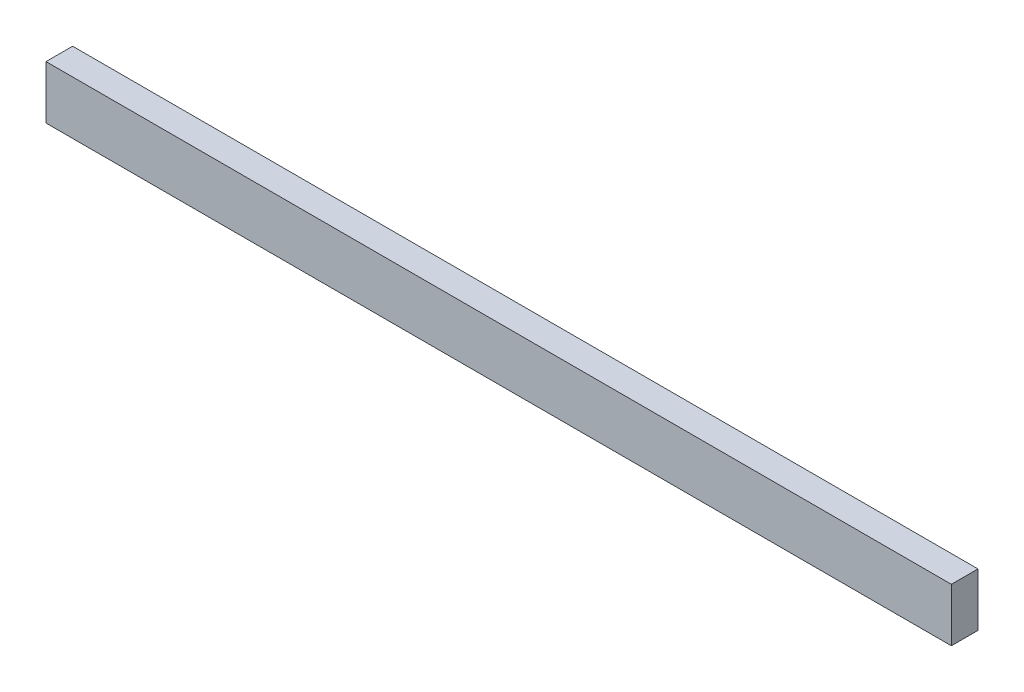
ISO-10303-21;
HEADER;
FILE_DESCRIPTION(('STEP AP214'),'2;1');
FILE_NAME('part.step','',(''),(''),'','','');
FILE_SCHEMA(('AUTOMOTIVE_DESIGN { 1 0 10303 214 1 1 1 1 }'));
ENDSEC;
DATA;
#1=APPLICATION_CONTEXT('core data for automotive mechanical design processes');
#2=APPLICATION_PROTOCOL_DEFINITION('international standard','automotive_design',2000,#1);
#3=PRODUCT_CONTEXT('',#1,'mechanical');
#4=PRODUCT('Part','Part','',(#3));
#5=PRODUCT_RELATED_PRODUCT_CATEGORY('part','',(#4));
#6=PRODUCT_DEFINITION_FORMATION('','',#4);
#7=PRODUCT_DEFINITION_CONTEXT('part definition',#1,'design');
#8=PRODUCT_DEFINITION('design','',#6,#7);
#9=PRODUCT_DEFINITION_SHAPE('','',#8);
#10=(LENGTH_UNIT() NAMED_UNIT(*) SI_UNIT(.MILLI.,.METRE.));
#11=(NAMED_UNIT(*) PLANE_ANGLE_UNIT() SI_UNIT($,.RADIAN.));
#12=(NAMED_UNIT(*) SI_UNIT($,.STERADIAN.) SOLID_ANGLE_UNIT());
#13=UNCERTAINTY_MEASURE_WITH_UNIT(LENGTH_MEASURE(1.E-05),#10,'distance_accuracy_value','');
#14=(GEOMETRIC_REPRESENTATION_CONTEXT(3) GLOBAL_UNCERTAINTY_ASSIGNED_CONTEXT((#13)) GLOBAL_UNIT_ASSIGNED_CONTEXT((#10,
#11,#12)) REPRESENTATION_CONTEXT('',''));
#15=CARTESIAN_POINT('',(0.,0.,0.));
#16=DIRECTION('',(0.,0.,1.));
#17=DIRECTION('',(1.,0.,0.));
#18=AXIS2_PLACEMENT_3D('',#15,#16,#17);
#19=CARTESIAN_POINT('',(0.,9.99999999999998,5.));
#20=DIRECTION('',(1.,0.,0.));
#21=DIRECTION('',(0.,1.,0.));
#22=AXIS2_PLACEMENT_3D('',#19,#20,#21);
#23=PLANE('',#22);
#24=DIRECTION('',(0.,-1.,0.));
#25=VECTOR('',#24,1.);
#26=CARTESIAN_POINT('',(0.,9.99999999999998,0.));
#27=LINE('',#26,#25);
#28=CARTESIAN_POINT('',(0.,9.99999999999998,0.));
#29=VERTEX_POINT('',#28);
#30=CARTESIAN_POINT('',(0.,0.,0.));
#31=VERTEX_POINT('',#30);
#32=EDGE_CURVE('E98',#29,#31,#27,.T.);
#33=ORIENTED_EDGE('',*,*,#32,.T.);
#34=DIRECTION('',(0.,0.,-1.));
#35=VECTOR('',#34,1.);
#36=CARTESIAN_POINT('',(0.,0.,5.));
#37=LINE('',#36,#35);
#38=CARTESIAN_POINT('',(0.,0.,5.));
#39=VERTEX_POINT('',#38);
#40=EDGE_CURVE('E11',#39,#31,#37,.T.);
#41=ORIENTED_EDGE('',*,*,#40,.F.);
#42=DIRECTION('',(0.,-1.,0.));
#43=VECTOR('',#42,1.);
#44=CARTESIAN_POINT('',(0.,9.99999999999998,5.));
#45=LINE('',#44,#43);
#46=CARTESIAN_POINT('',(0.,9.99999999999998,5.));
#47=VERTEX_POINT('',#46);
#48=EDGE_CURVE('E86',#47,#39,#45,.T.);
#49=ORIENTED_EDGE('',*,*,#48,.F.);
#50=DIRECTION('',(0.,0.,-1.));
#51=VECTOR('',#50,1.);
#52=CARTESIAN_POINT('',(0.,9.99999999999998,5.));
#53=LINE('',#52,#51);
#54=EDGE_CURVE('E94',#47,#29,#53,.T.);
#55=ORIENTED_EDGE('',*,*,#54,.T.);
#56=EDGE_LOOP('',(#33,#41,#49,#55));
#57=FACE_BOUND('',#56,.T.);
#58=ADVANCED_FACE('F35',(#57),#23,.F.);
#59=CARTESIAN_POINT('',(0.,0.,5.));
#60=DIRECTION('',(0.,1.,0.));
#61=DIRECTION('',(0.,0.,1.));
#62=AXIS2_PLACEMENT_3D('',#59,#60,#61);
#63=PLANE('',#62);
#64=DIRECTION('',(1.,0.,0.));
#65=VECTOR('',#64,1.);
#66=CARTESIAN_POINT('',(0.,0.,0.));
#67=LINE('',#66,#65);
#68=CARTESIAN_POINT('',(170.,0.,0.));
#69=VERTEX_POINT('',#68);
#70=EDGE_CURVE('E90',#31,#69,#67,.T.);
#71=ORIENTED_EDGE('',*,*,#70,.T.);
#72=DIRECTION('',(0.,0.,-1.));
#73=VECTOR('',#72,1.);
#74=CARTESIAN_POINT('',(170.,0.,5.));
#75=LINE('',#74,#73);
#76=CARTESIAN_POINT('',(170.,0.,5.));
#77=VERTEX_POINT('',#76);
#78=EDGE_CURVE('E43',#77,#69,#75,.T.);
#79=ORIENTED_EDGE('',*,*,#78,.F.);
#80=DIRECTION('',(1.,0.,0.));
#81=VECTOR('',#80,1.);
#82=CARTESIAN_POINT('',(0.,0.,5.));
#83=LINE('',#82,#81);
#84=EDGE_CURVE('E81',#39,#77,#83,.T.);
#85=ORIENTED_EDGE('',*,*,#84,.F.);
#86=ORIENTED_EDGE('',*,*,#40,.T.);
#87=EDGE_LOOP('',(#71,#79,#85,#86));
#88=FACE_BOUND('',#87,.T.);
#89=ADVANCED_FACE('F89',(#88),#63,.F.);
#90=CARTESIAN_POINT('',(170.,0.,5.));
#91=DIRECTION('',(-1.,0.,0.));
#92=DIRECTION('',(0.,0.,1.));
#93=AXIS2_PLACEMENT_3D('',#90,#91,#92);
#94=PLANE('',#93);
#95=DIRECTION('',(0.,1.,0.));
#96=VECTOR('',#95,1.);
#97=CARTESIAN_POINT('',(170.,0.,0.));
#98=LINE('',#97,#96);
#99=CARTESIAN_POINT('',(170.,10.,0.));
#100=VERTEX_POINT('',#99);
#101=EDGE_CURVE('E68',#69,#100,#98,.T.);
#102=ORIENTED_EDGE('',*,*,#101,.T.);
#103=DIRECTION('',(0.,0.,-1.));
#104=VECTOR('',#103,1.);
#105=CARTESIAN_POINT('',(170.,10.,5.));
#106=LINE('',#105,#104);
#107=CARTESIAN_POINT('',(170.,10.,5.));
#108=VERTEX_POINT('',#107);
#109=EDGE_CURVE('E91',#108,#100,#106,.T.);
#110=ORIENTED_EDGE('',*,*,#109,.F.);
#111=DIRECTION('',(0.,1.,0.));
#112=VECTOR('',#111,1.);
#113=CARTESIAN_POINT('',(170.,0.,5.));
#114=LINE('',#113,#112);
#115=EDGE_CURVE('E84',#77,#108,#114,.T.);
#116=ORIENTED_EDGE('',*,*,#115,.F.);
#117=ORIENTED_EDGE('',*,*,#78,.T.);
#118=EDGE_LOOP('',(#102,#110,#116,#117));
#119=FACE_BOUND('',#118,.T.);
#120=ADVANCED_FACE('F92',(#119),#94,.F.);
#121=CARTESIAN_POINT('',(170.,10.,5.));
#122=DIRECTION('',(0.,-1.,0.));
#123=DIRECTION('',(1.,0.,0.));
#124=AXIS2_PLACEMENT_3D('',#121,#122,#123);
#125=PLANE('',#124);
#126=DIRECTION('',(-1.,0.,0.));
#127=VECTOR('',#126,1.);
#128=CARTESIAN_POINT('',(170.,10.,0.));
#129=LINE('',#128,#127);
#130=EDGE_CURVE('E74',#100,#29,#129,.T.);
#131=ORIENTED_EDGE('',*,*,#130,.T.);
#132=ORIENTED_EDGE('',*,*,#54,.F.);
#133=DIRECTION('',(-1.,0.,0.));
#134=VECTOR('',#133,1.);
#135=CARTESIAN_POINT('',(170.,10.,5.));
#136=LINE('',#135,#134);
#137=EDGE_CURVE('E51',#108,#47,#136,.T.);
#138=ORIENTED_EDGE('',*,*,#137,.F.);
#139=ORIENTED_EDGE('',*,*,#109,.T.);
#140=EDGE_LOOP('',(#131,#132,#138,#139));
#141=FACE_BOUND('',#140,.T.);
#142=ADVANCED_FACE('F105',(#141),#125,.F.);
#143=CARTESIAN_POINT('',(0.,0.,5.));
#144=DIRECTION('',(0.,0.,1.));
#145=DIRECTION('',(1.,0.,0.));
#146=AXIS2_PLACEMENT_3D('',#143,#144,#145);
#147=PLANE('',#146);
#148=ORIENTED_EDGE('',*,*,#48,.T.);
#149=ORIENTED_EDGE('',*,*,#84,.T.);
#150=ORIENTED_EDGE('',*,*,#115,.T.);
#151=ORIENTED_EDGE('',*,*,#137,.T.);
#152=EDGE_LOOP('',(#148,#149,#150,#151));
#153=FACE_BOUND('',#152,.T.);
#154=ADVANCED_FACE('F82',(#153),#147,.T.);
#155=CARTESIAN_POINT('',(0.,0.,0.));
#156=DIRECTION('',(0.,0.,1.));
#157=DIRECTION('',(1.,0.,0.));
#158=AXIS2_PLACEMENT_3D('',#155,#156,#157);
#159=PLANE('',#158);
#160=ORIENTED_EDGE('',*,*,#32,.F.);
#161=ORIENTED_EDGE('',*,*,#130,.F.);
#162=ORIENTED_EDGE('',*,*,#101,.F.);
#163=ORIENTED_EDGE('',*,*,#70,.F.);
#164=EDGE_LOOP('',(#160,#161,#162,#163));
#165=FACE_BOUND('',#164,.T.);
#166=ADVANCED_FACE('F108',(#165),#159,.F.);
#167=CLOSED_SHELL('',(#58,#89,#120,#142,#154,#166));
#168=MANIFOLD_SOLID_BREP('B2',#167);
#169=ADVANCED_BREP_SHAPE_REPRESENTATION('',(#18,#168),#14);
#170=SHAPE_DEFINITION_REPRESENTATION(#9,#169);
ENDSEC;
END-ISO-10303-21;
